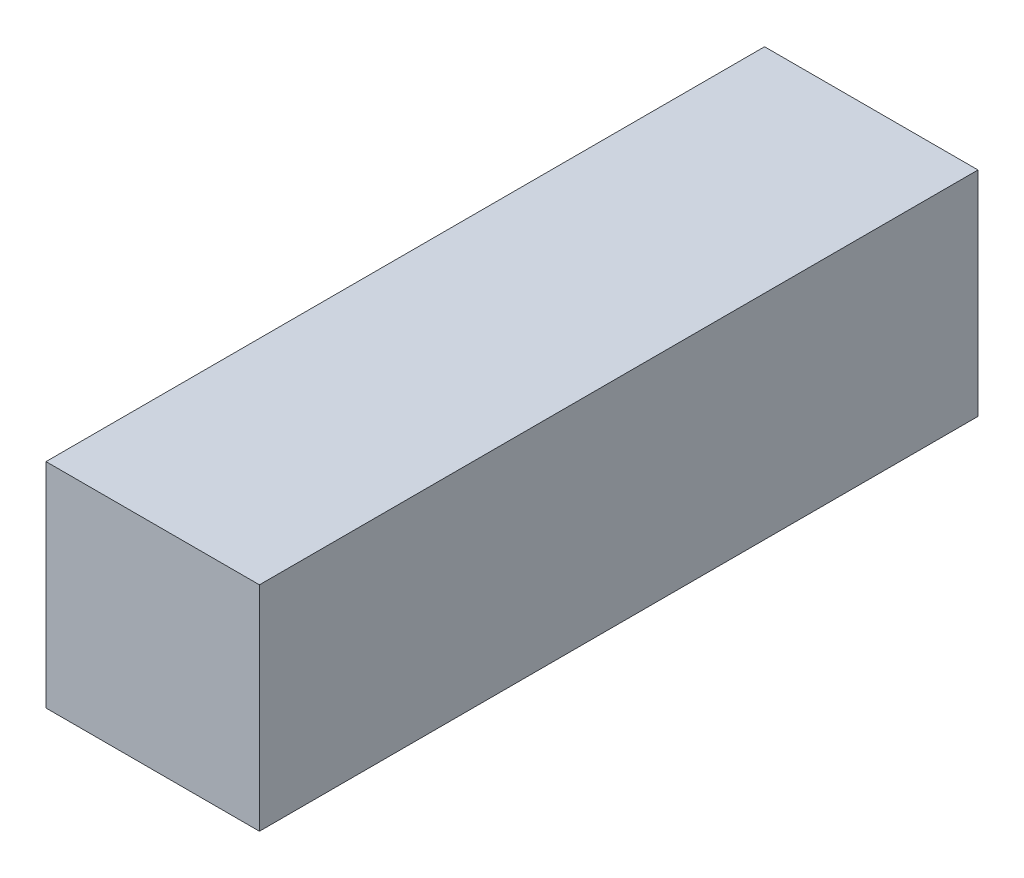
ISO-10303-21;
HEADER;
FILE_DESCRIPTION(('STEP AP214'),'2;1');
FILE_NAME('part.step','',(''),(''),'','','');
FILE_SCHEMA(('AUTOMOTIVE_DESIGN { 1 0 10303 214 1 1 1 1 }'));
ENDSEC;
DATA;
#1=APPLICATION_CONTEXT('core data for automotive mechanical design processes');
#2=APPLICATION_PROTOCOL_DEFINITION('international standard','automotive_design',2000,#1);
#3=PRODUCT_CONTEXT('',#1,'mechanical');
#4=PRODUCT('Part','Part','',(#3));
#5=PRODUCT_RELATED_PRODUCT_CATEGORY('part','',(#4));
#6=PRODUCT_DEFINITION_FORMATION('','',#4);
#7=PRODUCT_DEFINITION_CONTEXT('part definition',#1,'design');
#8=PRODUCT_DEFINITION('design','',#6,#7);
#9=PRODUCT_DEFINITION_SHAPE('','',#8);
#10=(LENGTH_UNIT() NAMED_UNIT(*) SI_UNIT(.MILLI.,.METRE.));
#11=(NAMED_UNIT(*) PLANE_ANGLE_UNIT() SI_UNIT($,.RADIAN.));
#12=(NAMED_UNIT(*) SI_UNIT($,.STERADIAN.) SOLID_ANGLE_UNIT());
#13=UNCERTAINTY_MEASURE_WITH_UNIT(LENGTH_MEASURE(1.E-05),#10,'distance_accuracy_value','');
#14=(GEOMETRIC_REPRESENTATION_CONTEXT(3) GLOBAL_UNCERTAINTY_ASSIGNED_CONTEXT((#13)) GLOBAL_UNIT_ASSIGNED_CONTEXT((#10,
#11,#12)) REPRESENTATION_CONTEXT('',''));
#15=CARTESIAN_POINT('',(0.,0.,0.));
#16=DIRECTION('',(0.,0.,1.));
#17=DIRECTION('',(1.,0.,0.));
#18=AXIS2_PLACEMENT_3D('',#15,#16,#17);
#19=CARTESIAN_POINT('',(15.,-15.,101.));
#20=DIRECTION('',(-1.,0.,0.));
#21=DIRECTION('',(0.,0.,1.));
#22=AXIS2_PLACEMENT_3D('',#19,#20,#21);
#23=PLANE('',#22);
#24=DIRECTION('',(0.,1.,0.));
#25=VECTOR('',#24,1.);
#26=CARTESIAN_POINT('',(15.,-15.,0.));
#27=LINE('',#26,#25);
#28=CARTESIAN_POINT('',(15.,-15.,0.));
#29=VERTEX_POINT('',#28);
#30=CARTESIAN_POINT('',(15.,15.,0.));
#31=VERTEX_POINT('',#30);
#32=EDGE_CURVE('E99',#29,#31,#27,.T.);
#33=ORIENTED_EDGE('',*,*,#32,.T.);
#34=DIRECTION('',(0.,0.,-1.));
#35=VECTOR('',#34,1.);
#36=CARTESIAN_POINT('',(15.,15.,101.));
#37=LINE('',#36,#35);
#38=CARTESIAN_POINT('',(15.,15.,101.));
#39=VERTEX_POINT('',#38);
#40=EDGE_CURVE('E11',#39,#31,#37,.T.);
#41=ORIENTED_EDGE('',*,*,#40,.F.);
#42=DIRECTION('',(0.,1.,0.));
#43=VECTOR('',#42,1.);
#44=CARTESIAN_POINT('',(15.,-15.,101.));
#45=LINE('',#44,#43);
#46=CARTESIAN_POINT('',(15.,-15.,101.));
#47=VERTEX_POINT('',#46);
#48=EDGE_CURVE('E87',#47,#39,#45,.T.);
#49=ORIENTED_EDGE('',*,*,#48,.F.);
#50=DIRECTION('',(0.,0.,-1.));
#51=VECTOR('',#50,1.);
#52=CARTESIAN_POINT('',(15.,-15.,101.));
#53=LINE('',#52,#51);
#54=EDGE_CURVE('E95',#47,#29,#53,.T.);
#55=ORIENTED_EDGE('',*,*,#54,.T.);
#56=EDGE_LOOP('',(#33,#41,#49,#55));
#57=FACE_BOUND('',#56,.T.);
#58=ADVANCED_FACE('F36',(#57),#23,.F.);
#59=CARTESIAN_POINT('',(-15.,15.,101.));
#60=DIRECTION('',(0.,-1.,0.));
#61=DIRECTION('',(0.,0.,-1.));
#62=AXIS2_PLACEMENT_3D('',#59,#60,#61);
#63=PLANE('',#62);
#64=DIRECTION('',(-1.,0.,0.));
#65=VECTOR('',#64,1.);
#66=CARTESIAN_POINT('',(-15.,15.,0.));
#67=LINE('',#66,#65);
#68=CARTESIAN_POINT('',(-15.,15.,0.));
#69=VERTEX_POINT('',#68);
#70=EDGE_CURVE('E91',#31,#69,#67,.T.);
#71=ORIENTED_EDGE('',*,*,#70,.T.);
#72=DIRECTION('',(0.,0.,-1.));
#73=VECTOR('',#72,1.);
#74=CARTESIAN_POINT('',(-15.,15.,101.));
#75=LINE('',#74,#73);
#76=CARTESIAN_POINT('',(-15.,15.,101.));
#77=VERTEX_POINT('',#76);
#78=EDGE_CURVE('E44',#77,#69,#75,.T.);
#79=ORIENTED_EDGE('',*,*,#78,.F.);
#80=DIRECTION('',(-1.,0.,0.));
#81=VECTOR('',#80,1.);
#82=CARTESIAN_POINT('',(-15.,15.,101.));
#83=LINE('',#82,#81);
#84=EDGE_CURVE('E82',#39,#77,#83,.T.);
#85=ORIENTED_EDGE('',*,*,#84,.F.);
#86=ORIENTED_EDGE('',*,*,#40,.T.);
#87=EDGE_LOOP('',(#71,#79,#85,#86));
#88=FACE_BOUND('',#87,.T.);
#89=ADVANCED_FACE('F90',(#88),#63,.F.);
#90=CARTESIAN_POINT('',(-15.,-15.,101.));
#91=DIRECTION('',(1.,0.,0.));
#92=DIRECTION('',(0.,0.,-1.));
#93=AXIS2_PLACEMENT_3D('',#90,#91,#92);
#94=PLANE('',#93);
#95=DIRECTION('',(0.,-1.,0.));
#96=VECTOR('',#95,1.);
#97=CARTESIAN_POINT('',(-15.,-15.,0.));
#98=LINE('',#97,#96);
#99=CARTESIAN_POINT('',(-15.,-15.,0.));
#100=VERTEX_POINT('',#99);
#101=EDGE_CURVE('E69',#69,#100,#98,.T.);
#102=ORIENTED_EDGE('',*,*,#101,.T.);
#103=DIRECTION('',(0.,0.,-1.));
#104=VECTOR('',#103,1.);
#105=CARTESIAN_POINT('',(-15.,-15.,101.));
#106=LINE('',#105,#104);
#107=CARTESIAN_POINT('',(-15.,-15.,101.));
#108=VERTEX_POINT('',#107);
#109=EDGE_CURVE('E92',#108,#100,#106,.T.);
#110=ORIENTED_EDGE('',*,*,#109,.F.);
#111=DIRECTION('',(0.,-1.,0.));
#112=VECTOR('',#111,1.);
#113=CARTESIAN_POINT('',(-15.,-15.,101.));
#114=LINE('',#113,#112);
#115=EDGE_CURVE('E85',#77,#108,#114,.T.);
#116=ORIENTED_EDGE('',*,*,#115,.F.);
#117=ORIENTED_EDGE('',*,*,#78,.T.);
#118=EDGE_LOOP('',(#102,#110,#116,#117));
#119=FACE_BOUND('',#118,.T.);
#120=ADVANCED_FACE('F93',(#119),#94,.F.);
#121=CARTESIAN_POINT('',(-15.,-15.,101.));
#122=DIRECTION('',(0.,1.,0.));
#123=DIRECTION('',(0.,0.,1.));
#124=AXIS2_PLACEMENT_3D('',#121,#122,#123);
#125=PLANE('',#124);
#126=DIRECTION('',(1.,0.,0.));
#127=VECTOR('',#126,1.);
#128=CARTESIAN_POINT('',(-15.,-15.,0.));
#129=LINE('',#128,#127);
#130=EDGE_CURVE('E75',#100,#29,#129,.T.);
#131=ORIENTED_EDGE('',*,*,#130,.T.);
#132=ORIENTED_EDGE('',*,*,#54,.F.);
#133=DIRECTION('',(1.,0.,0.));
#134=VECTOR('',#133,1.);
#135=CARTESIAN_POINT('',(-15.,-15.,101.));
#136=LINE('',#135,#134);
#137=EDGE_CURVE('E52',#108,#47,#136,.T.);
#138=ORIENTED_EDGE('',*,*,#137,.F.);
#139=ORIENTED_EDGE('',*,*,#109,.T.);
#140=EDGE_LOOP('',(#131,#132,#138,#139));
#141=FACE_BOUND('',#140,.T.);
#142=ADVANCED_FACE('F106',(#141),#125,.F.);
#143=CARTESIAN_POINT('',(0.,0.,101.));
#144=DIRECTION('',(0.,0.,-1.));
#145=DIRECTION('',(-1.,0.,0.));
#146=AXIS2_PLACEMENT_3D('',#143,#144,#145);
#147=PLANE('',#146);
#148=ORIENTED_EDGE('',*,*,#48,.T.);
#149=ORIENTED_EDGE('',*,*,#84,.T.);
#150=ORIENTED_EDGE('',*,*,#115,.T.);
#151=ORIENTED_EDGE('',*,*,#137,.T.);
#152=EDGE_LOOP('',(#148,#149,#150,#151));
#153=FACE_BOUND('',#152,.T.);
#154=ADVANCED_FACE('F83',(#153),#147,.F.);
#155=CARTESIAN_POINT('',(0.,0.,0.));
#156=DIRECTION('',(0.,0.,-1.));
#157=DIRECTION('',(-1.,0.,0.));
#158=AXIS2_PLACEMENT_3D('',#155,#156,#157);
#159=PLANE('',#158);
#160=ORIENTED_EDGE('',*,*,#32,.F.);
#161=ORIENTED_EDGE('',*,*,#130,.F.);
#162=ORIENTED_EDGE('',*,*,#101,.F.);
#163=ORIENTED_EDGE('',*,*,#70,.F.);
#164=EDGE_LOOP('',(#160,#161,#162,#163));
#165=FACE_BOUND('',#164,.T.);
#166=ADVANCED_FACE('F109',(#165),#159,.T.);
#167=CLOSED_SHELL('',(#58,#89,#120,#142,#154,#166));
#168=MANIFOLD_SOLID_BREP('B2',#167);
#169=ADVANCED_BREP_SHAPE_REPRESENTATION('',(#18,#168),#14);
#170=SHAPE_DEFINITION_REPRESENTATION(#9,#169);
ENDSEC;
END-ISO-10303-21;
